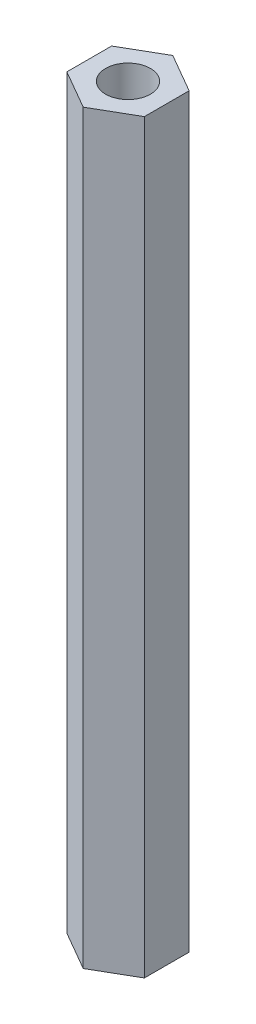
ISO-10303-21;
HEADER;
FILE_DESCRIPTION(('STEP AP214'),'2;1');
FILE_NAME('part.step','',(''),(''),'','','');
FILE_SCHEMA(('AUTOMOTIVE_DESIGN { 1 0 10303 214 1 1 1 1 }'));
ENDSEC;
DATA;
#1=APPLICATION_CONTEXT('core data for automotive mechanical design processes');
#2=APPLICATION_PROTOCOL_DEFINITION('international standard','automotive_design',2000,#1);
#3=PRODUCT_CONTEXT('',#1,'mechanical');
#4=PRODUCT('Part','Part','',(#3));
#5=PRODUCT_RELATED_PRODUCT_CATEGORY('part','',(#4));
#6=PRODUCT_DEFINITION_FORMATION('','',#4);
#7=PRODUCT_DEFINITION_CONTEXT('part definition',#1,'design');
#8=PRODUCT_DEFINITION('design','',#6,#7);
#9=PRODUCT_DEFINITION_SHAPE('','',#8);
#10=(LENGTH_UNIT() NAMED_UNIT(*) SI_UNIT(.MILLI.,.METRE.));
#11=(NAMED_UNIT(*) PLANE_ANGLE_UNIT() SI_UNIT($,.RADIAN.));
#12=(NAMED_UNIT(*) SI_UNIT($,.STERADIAN.) SOLID_ANGLE_UNIT());
#13=UNCERTAINTY_MEASURE_WITH_UNIT(LENGTH_MEASURE(1.E-05),#10,'distance_accuracy_value','');
#14=(GEOMETRIC_REPRESENTATION_CONTEXT(3) GLOBAL_UNCERTAINTY_ASSIGNED_CONTEXT((#13)) GLOBAL_UNIT_ASSIGNED_CONTEXT((#10,
#11,#12)) REPRESENTATION_CONTEXT('',''));
#15=CARTESIAN_POINT('',(0.,0.,0.));
#16=DIRECTION('',(0.,0.,1.));
#17=DIRECTION('',(1.,0.,0.));
#18=AXIS2_PLACEMENT_3D('',#15,#16,#17);
#19=CARTESIAN_POINT('',(-2.59807621135332,50.,1.5));
#20=DIRECTION('',(0.5,0.,-0.866025403784439));
#21=DIRECTION('',(-0.866025403784439,0.,-0.5));
#22=AXIS2_PLACEMENT_3D('',#19,#20,#21);
#23=PLANE('',#22);
#24=DIRECTION('',(0.866025403784439,0.,0.5));
#25=VECTOR('',#24,1.);
#26=CARTESIAN_POINT('',(-2.59807621135332,0.,1.5));
#27=LINE('',#26,#25);
#28=CARTESIAN_POINT('',(-2.59807621135332,0.,1.5));
#29=VERTEX_POINT('',#28);
#30=CARTESIAN_POINT('',(0.,0.,3.));
#31=VERTEX_POINT('',#30);
#32=EDGE_CURVE('E124',#29,#31,#27,.T.);
#33=ORIENTED_EDGE('',*,*,#32,.T.);
#34=DIRECTION('',(0.,-1.,0.));
#35=VECTOR('',#34,1.);
#36=CARTESIAN_POINT('',(0.,50.,3.));
#37=LINE('',#36,#35);
#38=CARTESIAN_POINT('',(0.,50.,3.));
#39=VERTEX_POINT('',#38);
#40=EDGE_CURVE('E11',#39,#31,#37,.T.);
#41=ORIENTED_EDGE('',*,*,#40,.F.);
#42=DIRECTION('',(0.866025403784439,0.,0.5));
#43=VECTOR('',#42,1.);
#44=CARTESIAN_POINT('',(-2.59807621135332,50.,1.5));
#45=LINE('',#44,#43);
#46=CARTESIAN_POINT('',(-2.59807621135332,50.,1.5));
#47=VERTEX_POINT('',#46);
#48=EDGE_CURVE('E135',#47,#39,#45,.T.);
#49=ORIENTED_EDGE('',*,*,#48,.F.);
#50=DIRECTION('',(0.,-1.,0.));
#51=VECTOR('',#50,1.);
#52=CARTESIAN_POINT('',(-2.59807621135332,50.,1.5));
#53=LINE('',#52,#51);
#54=EDGE_CURVE('E120',#47,#29,#53,.T.);
#55=ORIENTED_EDGE('',*,*,#54,.T.);
#56=EDGE_LOOP('',(#33,#41,#49,#55));
#57=FACE_BOUND('',#56,.T.);
#58=ADVANCED_FACE('F40',(#57),#23,.F.);
#59=CARTESIAN_POINT('',(0.,50.,3.));
#60=DIRECTION('',(-0.5,0.,-0.866025403784439));
#61=DIRECTION('',(-0.866025403784439,0.,0.5));
#62=AXIS2_PLACEMENT_3D('',#59,#60,#61);
#63=PLANE('',#62);
#64=DIRECTION('',(0.866025403784439,0.,-0.5));
#65=VECTOR('',#64,1.);
#66=CARTESIAN_POINT('',(0.,0.,3.));
#67=LINE('',#66,#65);
#68=CARTESIAN_POINT('',(2.59807621135332,0.,1.5));
#69=VERTEX_POINT('',#68);
#70=EDGE_CURVE('E127',#31,#69,#67,.T.);
#71=ORIENTED_EDGE('',*,*,#70,.T.);
#72=DIRECTION('',(0.,-1.,0.));
#73=VECTOR('',#72,1.);
#74=CARTESIAN_POINT('',(2.59807621135332,50.,1.5));
#75=LINE('',#74,#73);
#76=CARTESIAN_POINT('',(2.59807621135332,50.,1.5));
#77=VERTEX_POINT('',#76);
#78=EDGE_CURVE('E48',#77,#69,#75,.T.);
#79=ORIENTED_EDGE('',*,*,#78,.F.);
#80=DIRECTION('',(0.866025403784439,0.,-0.5));
#81=VECTOR('',#80,1.);
#82=CARTESIAN_POINT('',(0.,50.,3.));
#83=LINE('',#82,#81);
#84=EDGE_CURVE('E93',#39,#77,#83,.T.);
#85=ORIENTED_EDGE('',*,*,#84,.F.);
#86=ORIENTED_EDGE('',*,*,#40,.T.);
#87=EDGE_LOOP('',(#71,#79,#85,#86));
#88=FACE_BOUND('',#87,.T.);
#89=ADVANCED_FACE('F160',(#88),#63,.F.);
#90=CARTESIAN_POINT('',(2.59807621135332,50.,1.5));
#91=DIRECTION('',(-1.,0.,0.));
#92=DIRECTION('',(0.,0.,1.));
#93=AXIS2_PLACEMENT_3D('',#90,#91,#92);
#94=PLANE('',#93);
#95=DIRECTION('',(0.,0.,-1.));
#96=VECTOR('',#95,1.);
#97=CARTESIAN_POINT('',(2.59807621135332,0.,1.5));
#98=LINE('',#97,#96);
#99=CARTESIAN_POINT('',(2.59807621135331,0.,-1.5));
#100=VERTEX_POINT('',#99);
#101=EDGE_CURVE('E130',#69,#100,#98,.T.);
#102=ORIENTED_EDGE('',*,*,#101,.T.);
#103=DIRECTION('',(0.,-1.,0.));
#104=VECTOR('',#103,1.);
#105=CARTESIAN_POINT('',(2.59807621135331,50.,-1.5));
#106=LINE('',#105,#104);
#107=CARTESIAN_POINT('',(2.59807621135331,50.,-1.5));
#108=VERTEX_POINT('',#107);
#109=EDGE_CURVE('E115',#108,#100,#106,.T.);
#110=ORIENTED_EDGE('',*,*,#109,.F.);
#111=DIRECTION('',(0.,0.,-1.));
#112=VECTOR('',#111,1.);
#113=CARTESIAN_POINT('',(2.59807621135332,50.,1.5));
#114=LINE('',#113,#112);
#115=EDGE_CURVE('E106',#77,#108,#114,.T.);
#116=ORIENTED_EDGE('',*,*,#115,.F.);
#117=ORIENTED_EDGE('',*,*,#78,.T.);
#118=EDGE_LOOP('',(#102,#110,#116,#117));
#119=FACE_BOUND('',#118,.T.);
#120=ADVANCED_FACE('F141',(#119),#94,.F.);
#121=CARTESIAN_POINT('',(2.59807621135331,50.,-1.5));
#122=DIRECTION('',(-0.5,0.,0.866025403784439));
#123=DIRECTION('',(0.866025403784439,0.,0.5));
#124=AXIS2_PLACEMENT_3D('',#121,#122,#123);
#125=PLANE('',#124);
#126=DIRECTION('',(-0.866025403784439,0.,-0.5));
#127=VECTOR('',#126,1.);
#128=CARTESIAN_POINT('',(2.59807621135331,0.,-1.5));
#129=LINE('',#128,#127);
#130=CARTESIAN_POINT('',(0.,0.,-3.));
#131=VERTEX_POINT('',#130);
#132=EDGE_CURVE('E114',#100,#131,#129,.T.);
#133=ORIENTED_EDGE('',*,*,#132,.T.);
#134=DIRECTION('',(0.,-1.,0.));
#135=VECTOR('',#134,1.);
#136=CARTESIAN_POINT('',(0.,50.,-3.));
#137=LINE('',#136,#135);
#138=CARTESIAN_POINT('',(0.,50.,-3.));
#139=VERTEX_POINT('',#138);
#140=EDGE_CURVE('E111',#139,#131,#137,.T.);
#141=ORIENTED_EDGE('',*,*,#140,.F.);
#142=DIRECTION('',(-0.866025403784439,0.,-0.5));
#143=VECTOR('',#142,1.);
#144=CARTESIAN_POINT('',(2.59807621135331,50.,-1.5));
#145=LINE('',#144,#143);
#146=EDGE_CURVE('E100',#108,#139,#145,.T.);
#147=ORIENTED_EDGE('',*,*,#146,.F.);
#148=ORIENTED_EDGE('',*,*,#109,.T.);
#149=EDGE_LOOP('',(#133,#141,#147,#148));
#150=FACE_BOUND('',#149,.T.);
#151=ADVANCED_FACE('F112',(#150),#125,.F.);
#152=CARTESIAN_POINT('',(0.,50.,-3.));
#153=DIRECTION('',(0.5,0.,0.866025403784439));
#154=DIRECTION('',(0.866025403784439,0.,-0.5));
#155=AXIS2_PLACEMENT_3D('',#152,#153,#154);
#156=PLANE('',#155);
#157=DIRECTION('',(-0.866025403784439,0.,0.5));
#158=VECTOR('',#157,1.);
#159=CARTESIAN_POINT('',(0.,0.,-3.));
#160=LINE('',#159,#158);
#161=CARTESIAN_POINT('',(-2.59807621135332,0.,-1.5));
#162=VERTEX_POINT('',#161);
#163=EDGE_CURVE('E79',#131,#162,#160,.T.);
#164=ORIENTED_EDGE('',*,*,#163,.T.);
#165=DIRECTION('',(0.,-1.,0.));
#166=VECTOR('',#165,1.);
#167=CARTESIAN_POINT('',(-2.59807621135332,50.,-1.5));
#168=LINE('',#167,#166);
#169=CARTESIAN_POINT('',(-2.59807621135332,50.,-1.5));
#170=VERTEX_POINT('',#169);
#171=EDGE_CURVE('E116',#170,#162,#168,.T.);
#172=ORIENTED_EDGE('',*,*,#171,.F.);
#173=DIRECTION('',(-0.866025403784439,0.,0.5));
#174=VECTOR('',#173,1.);
#175=CARTESIAN_POINT('',(0.,50.,-3.));
#176=LINE('',#175,#174);
#177=EDGE_CURVE('E104',#139,#170,#176,.T.);
#178=ORIENTED_EDGE('',*,*,#177,.F.);
#179=ORIENTED_EDGE('',*,*,#140,.T.);
#180=EDGE_LOOP('',(#164,#172,#178,#179));
#181=FACE_BOUND('',#180,.T.);
#182=ADVANCED_FACE('F118',(#181),#156,.F.);
#183=CARTESIAN_POINT('',(-2.59807621135332,50.,-1.5));
#184=DIRECTION('',(1.,0.,0.));
#185=DIRECTION('',(0.,0.,-1.));
#186=AXIS2_PLACEMENT_3D('',#183,#184,#185);
#187=PLANE('',#186);
#188=DIRECTION('',(0.,0.,1.));
#189=VECTOR('',#188,1.);
#190=CARTESIAN_POINT('',(-2.59807621135332,0.,-1.5));
#191=LINE('',#190,#189);
#192=EDGE_CURVE('E85',#162,#29,#191,.T.);
#193=ORIENTED_EDGE('',*,*,#192,.T.);
#194=ORIENTED_EDGE('',*,*,#54,.F.);
#195=DIRECTION('',(0.,0.,1.));
#196=VECTOR('',#195,1.);
#197=CARTESIAN_POINT('',(-2.59807621135332,50.,-1.5));
#198=LINE('',#197,#196);
#199=EDGE_CURVE('E56',#170,#47,#198,.T.);
#200=ORIENTED_EDGE('',*,*,#199,.F.);
#201=ORIENTED_EDGE('',*,*,#171,.T.);
#202=EDGE_LOOP('',(#193,#194,#200,#201));
#203=FACE_BOUND('',#202,.T.);
#204=ADVANCED_FACE('F148',(#203),#187,.F.);
#205=CARTESIAN_POINT('',(0.,50.,0.));
#206=DIRECTION('',(0.,1.,0.));
#207=DIRECTION('',(0.,0.,1.));
#208=AXIS2_PLACEMENT_3D('',#205,#206,#207);
#209=PLANE('',#208);
#210=CARTESIAN_POINT('',(0.,50.,0.));
#211=DIRECTION('',(0.,1.,0.));
#212=DIRECTION('',(0.,0.,1.));
#213=AXIS2_PLACEMENT_3D('',#210,#211,#212);
#214=CIRCLE('',#213,1.5);
#215=CARTESIAN_POINT('',(0.,50.,1.5));
#216=VERTEX_POINT('',#215);
#217=EDGE_CURVE('E215',#216,#216,#214,.T.);
#218=ORIENTED_EDGE('',*,*,#217,.F.);
#219=EDGE_LOOP('',(#218));
#220=FACE_BOUND('',#219,.T.);
#221=ORIENTED_EDGE('',*,*,#48,.T.);
#222=ORIENTED_EDGE('',*,*,#84,.T.);
#223=ORIENTED_EDGE('',*,*,#115,.T.);
#224=ORIENTED_EDGE('',*,*,#146,.T.);
#225=ORIENTED_EDGE('',*,*,#177,.T.);
#226=ORIENTED_EDGE('',*,*,#199,.T.);
#227=EDGE_LOOP('',(#221,#222,#223,#224,#225,#226));
#228=FACE_BOUND('',#227,.T.);
#229=ADVANCED_FACE('F102',(#220,#228),#209,.T.);
#230=CARTESIAN_POINT('',(0.,0.,0.));
#231=DIRECTION('',(0.,1.,0.));
#232=DIRECTION('',(0.,0.,1.));
#233=AXIS2_PLACEMENT_3D('',#230,#231,#232);
#234=PLANE('',#233);
#235=CARTESIAN_POINT('',(0.,0.,0.));
#236=DIRECTION('',(0.,1.,0.));
#237=DIRECTION('',(0.,0.,1.));
#238=AXIS2_PLACEMENT_3D('',#235,#236,#237);
#239=CIRCLE('',#238,1.5);
#240=CARTESIAN_POINT('',(0.,0.,1.5));
#241=VERTEX_POINT('',#240);
#242=EDGE_CURVE('E128',#241,#241,#239,.T.);
#243=ORIENTED_EDGE('',*,*,#242,.T.);
#244=EDGE_LOOP('',(#243));
#245=FACE_BOUND('',#244,.T.);
#246=ORIENTED_EDGE('',*,*,#32,.F.);
#247=ORIENTED_EDGE('',*,*,#192,.F.);
#248=ORIENTED_EDGE('',*,*,#163,.F.);
#249=ORIENTED_EDGE('',*,*,#132,.F.);
#250=ORIENTED_EDGE('',*,*,#101,.F.);
#251=ORIENTED_EDGE('',*,*,#70,.F.);
#252=EDGE_LOOP('',(#246,#247,#248,#249,#250,#251));
#253=FACE_BOUND('',#252,.T.);
#254=ADVANCED_FACE('F144',(#245,#253),#234,.F.);
#255=CARTESIAN_POINT('',(0.,0.,0.));
#256=DIRECTION('',(0.,1.,0.));
#257=DIRECTION('',(0.,0.,1.));
#258=AXIS2_PLACEMENT_3D('',#255,#256,#257);
#259=CYLINDRICAL_SURFACE('',#258,1.5);
#260=ORIENTED_EDGE('',*,*,#242,.F.);
#261=EDGE_LOOP('',(#260));
#262=FACE_BOUND('',#261,.T.);
#263=ORIENTED_EDGE('',*,*,#217,.T.);
#264=EDGE_LOOP('',(#263));
#265=FACE_BOUND('',#264,.T.);
#266=ADVANCED_FACE('F197',(#262,#265),#259,.F.);
#267=CLOSED_SHELL('',(#58,#89,#120,#151,#182,#204,#229,#254,#266));
#268=MANIFOLD_SOLID_BREP('B2',#267);
#269=ADVANCED_BREP_SHAPE_REPRESENTATION('',(#18,#268),#14);
#270=SHAPE_DEFINITION_REPRESENTATION(#9,#269);
ENDSEC;
END-ISO-10303-21;
